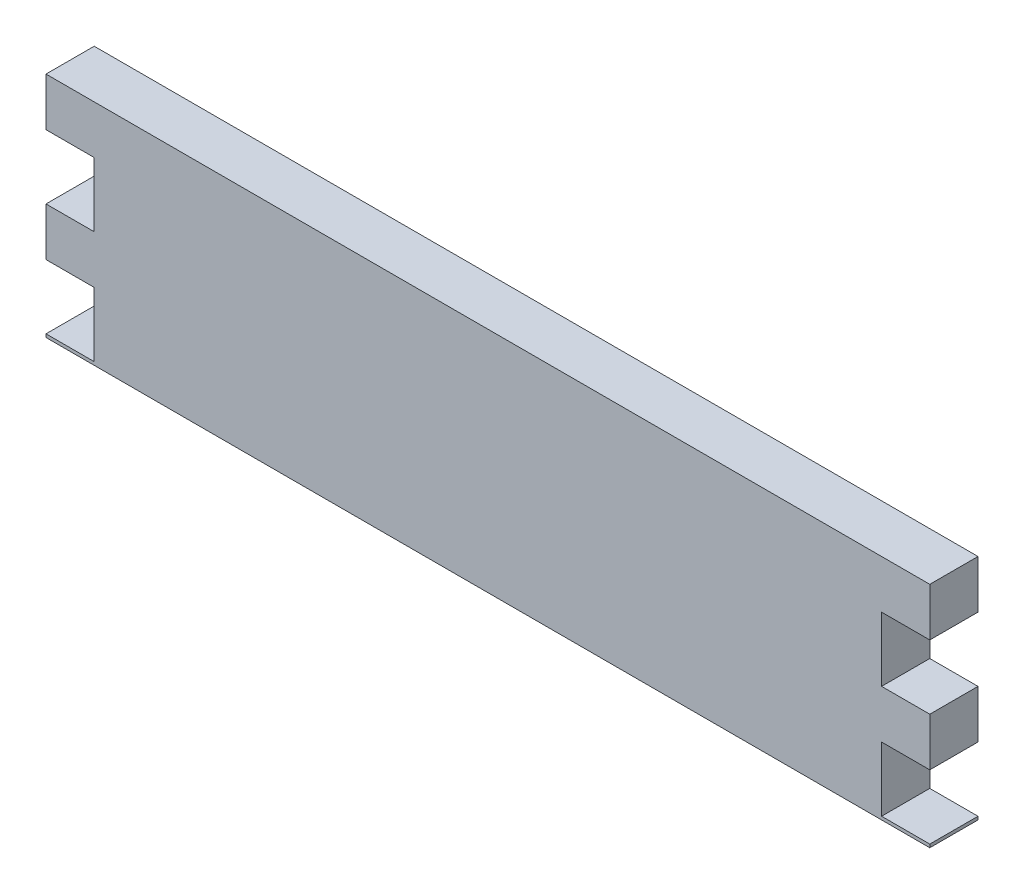
ISO-10303-21;
HEADER;
FILE_DESCRIPTION(('STEP AP214'),'2;1');
FILE_NAME('part.step','',(''),(''),'','','');
FILE_SCHEMA(('AUTOMOTIVE_DESIGN { 1 0 10303 214 1 1 1 1 }'));
ENDSEC;
DATA;
#1=APPLICATION_CONTEXT('core data for automotive mechanical design processes');
#2=APPLICATION_PROTOCOL_DEFINITION('international standard','automotive_design',2000,#1);
#3=PRODUCT_CONTEXT('',#1,'mechanical');
#4=PRODUCT('Part','Part','',(#3));
#5=PRODUCT_RELATED_PRODUCT_CATEGORY('part','',(#4));
#6=PRODUCT_DEFINITION_FORMATION('','',#4);
#7=PRODUCT_DEFINITION_CONTEXT('part definition',#1,'design');
#8=PRODUCT_DEFINITION('design','',#6,#7);
#9=PRODUCT_DEFINITION_SHAPE('','',#8);
#10=(LENGTH_UNIT() NAMED_UNIT(*) SI_UNIT(.MILLI.,.METRE.));
#11=(NAMED_UNIT(*) PLANE_ANGLE_UNIT() SI_UNIT($,.RADIAN.));
#12=(NAMED_UNIT(*) SI_UNIT($,.STERADIAN.) SOLID_ANGLE_UNIT());
#13=UNCERTAINTY_MEASURE_WITH_UNIT(LENGTH_MEASURE(1.E-05),#10,'distance_accuracy_value','');
#14=(GEOMETRIC_REPRESENTATION_CONTEXT(3) GLOBAL_UNCERTAINTY_ASSIGNED_CONTEXT((#13)) GLOBAL_UNIT_ASSIGNED_CONTEXT((#10,
#11,#12)) REPRESENTATION_CONTEXT('',''));
#15=CARTESIAN_POINT('',(0.,0.,0.));
#16=DIRECTION('',(0.,0.,1.));
#17=DIRECTION('',(1.,0.,0.));
#18=AXIS2_PLACEMENT_3D('',#15,#16,#17);
#19=CARTESIAN_POINT('',(27.5,-7.1,3.));
#20=DIRECTION('',(-1.,0.,0.));
#21=DIRECTION('',(0.,0.,1.));
#22=AXIS2_PLACEMENT_3D('',#19,#20,#21);
#23=PLANE('',#22);
#24=DIRECTION('',(0.,1.,0.));
#25=VECTOR('',#24,1.);
#26=CARTESIAN_POINT('',(27.5,-7.1,0.));
#27=LINE('',#26,#25);
#28=CARTESIAN_POINT('',(27.5,-2.9,0.));
#29=VERTEX_POINT('',#28);
#30=CARTESIAN_POINT('',(27.5,0.0999999999999998,0.));
#31=VERTEX_POINT('',#30);
#32=EDGE_CURVE('E223',#29,#31,#27,.T.);
#33=ORIENTED_EDGE('',*,*,#32,.T.);
#34=DIRECTION('',(0.,0.,1.));
#35=VECTOR('',#34,1.);
#36=CARTESIAN_POINT('',(27.5,0.0999999999999998,-7.));
#37=LINE('',#36,#35);
#38=CARTESIAN_POINT('',(27.5,0.0999999999999998,3.));
#39=VERTEX_POINT('',#38);
#40=EDGE_CURVE('E295',#31,#39,#37,.T.);
#41=ORIENTED_EDGE('',*,*,#40,.T.);
#42=DIRECTION('',(0.,1.,0.));
#43=VECTOR('',#42,1.);
#44=CARTESIAN_POINT('',(27.5,-7.1,3.));
#45=LINE('',#44,#43);
#46=CARTESIAN_POINT('',(27.5,-2.9,3.));
#47=VERTEX_POINT('',#46);
#48=EDGE_CURVE('E197',#47,#39,#45,.T.);
#49=ORIENTED_EDGE('',*,*,#48,.F.);
#50=DIRECTION('',(0.,0.,1.));
#51=VECTOR('',#50,1.);
#52=CARTESIAN_POINT('',(27.5,-2.9,-7.));
#53=LINE('',#52,#51);
#54=EDGE_CURVE('E319',#29,#47,#53,.T.);
#55=ORIENTED_EDGE('',*,*,#54,.F.);
#56=EDGE_LOOP('',(#33,#41,#49,#55));
#57=FACE_BOUND('',#56,.T.);
#58=ADVANCED_FACE('F38',(#57),#23,.F.);
#59=CARTESIAN_POINT('',(27.5,-7.1,0.));
#60=VERTEX_POINT('',#59);
#61=CARTESIAN_POINT('',(27.5,-6.9,0.));
#62=VERTEX_POINT('',#61);
#63=EDGE_CURVE('E219',#60,#62,#27,.T.);
#64=ORIENTED_EDGE('',*,*,#63,.T.);
#65=DIRECTION('',(0.,0.,1.));
#66=VECTOR('',#65,1.);
#67=CARTESIAN_POINT('',(27.5,-6.9,-7.));
#68=LINE('',#67,#66);
#69=CARTESIAN_POINT('',(27.5,-6.9,3.));
#70=VERTEX_POINT('',#69);
#71=EDGE_CURVE('E320',#62,#70,#68,.T.);
#72=ORIENTED_EDGE('',*,*,#71,.T.);
#73=CARTESIAN_POINT('',(27.5,-7.1,3.));
#74=VERTEX_POINT('',#73);
#75=EDGE_CURVE('E200',#74,#70,#45,.T.);
#76=ORIENTED_EDGE('',*,*,#75,.F.);
#77=DIRECTION('',(0.,0.,-1.));
#78=VECTOR('',#77,1.);
#79=CARTESIAN_POINT('',(27.5,-7.1,3.));
#80=LINE('',#79,#78);
#81=EDGE_CURVE('E218',#74,#60,#80,.T.);
#82=ORIENTED_EDGE('',*,*,#81,.T.);
#83=EDGE_LOOP('',(#64,#72,#76,#82));
#84=FACE_BOUND('',#83,.T.);
#85=ADVANCED_FACE('F352',(#84),#23,.F.);
#86=CARTESIAN_POINT('',(-27.5,-7.1,3.));
#87=DIRECTION('',(1.,0.,0.));
#88=DIRECTION('',(0.,0.,-1.));
#89=AXIS2_PLACEMENT_3D('',#86,#87,#88);
#90=PLANE('',#89);
#91=DIRECTION('',(0.,-1.,0.));
#92=VECTOR('',#91,1.);
#93=CARTESIAN_POINT('',(-27.5,-7.1,0.));
#94=LINE('',#93,#92);
#95=CARTESIAN_POINT('',(-27.5,7.1,0.));
#96=VERTEX_POINT('',#95);
#97=CARTESIAN_POINT('',(-27.5,4.1,0.));
#98=VERTEX_POINT('',#97);
#99=EDGE_CURVE('E201',#96,#98,#94,.T.);
#100=ORIENTED_EDGE('',*,*,#99,.T.);
#101=DIRECTION('',(0.,0.,1.));
#102=VECTOR('',#101,1.);
#103=CARTESIAN_POINT('',(-27.5,4.1,-7.));
#104=LINE('',#103,#102);
#105=CARTESIAN_POINT('',(-27.5,4.1,3.));
#106=VERTEX_POINT('',#105);
#107=EDGE_CURVE('E269',#98,#106,#104,.T.);
#108=ORIENTED_EDGE('',*,*,#107,.T.);
#109=DIRECTION('',(0.,-1.,0.));
#110=VECTOR('',#109,1.);
#111=CARTESIAN_POINT('',(-27.5,-7.1,3.));
#112=LINE('',#111,#110);
#113=CARTESIAN_POINT('',(-27.5,7.1,3.));
#114=VERTEX_POINT('',#113);
#115=EDGE_CURVE('E214',#114,#106,#112,.T.);
#116=ORIENTED_EDGE('',*,*,#115,.F.);
#117=DIRECTION('',(0.,0.,-1.));
#118=VECTOR('',#117,1.);
#119=CARTESIAN_POINT('',(-27.5,7.1,3.));
#120=LINE('',#119,#118);
#121=EDGE_CURVE('E235',#114,#96,#120,.T.);
#122=ORIENTED_EDGE('',*,*,#121,.T.);
#123=EDGE_LOOP('',(#100,#108,#116,#122));
#124=FACE_BOUND('',#123,.T.);
#125=ADVANCED_FACE('F398',(#124),#90,.F.);
#126=CARTESIAN_POINT('',(-27.5,0.0999999999999994,3.));
#127=VERTEX_POINT('',#126);
#128=CARTESIAN_POINT('',(-27.5,-2.9,3.));
#129=VERTEX_POINT('',#128);
#130=EDGE_CURVE('E212',#127,#129,#112,.T.);
#131=ORIENTED_EDGE('',*,*,#130,.F.);
#132=DIRECTION('',(0.,0.,1.));
#133=VECTOR('',#132,1.);
#134=CARTESIAN_POINT('',(-27.5,0.0999999999999994,-7.));
#135=LINE('',#134,#133);
#136=CARTESIAN_POINT('',(-27.5,0.0999999999999994,0.));
#137=VERTEX_POINT('',#136);
#138=EDGE_CURVE('E283',#137,#127,#135,.T.);
#139=ORIENTED_EDGE('',*,*,#138,.F.);
#140=CARTESIAN_POINT('',(-27.5,-2.9,0.));
#141=VERTEX_POINT('',#140);
#142=EDGE_CURVE('E228',#137,#141,#94,.T.);
#143=ORIENTED_EDGE('',*,*,#142,.T.);
#144=DIRECTION('',(0.,0.,1.));
#145=VECTOR('',#144,1.);
#146=CARTESIAN_POINT('',(-27.5,-2.9,-7.));
#147=LINE('',#146,#145);
#148=EDGE_CURVE('E292',#141,#129,#147,.T.);
#149=ORIENTED_EDGE('',*,*,#148,.T.);
#150=EDGE_LOOP('',(#131,#139,#143,#149));
#151=FACE_BOUND('',#150,.T.);
#152=ADVANCED_FACE('F368',(#151),#90,.F.);
#153=CARTESIAN_POINT('',(27.5,4.1,3.));
#154=VERTEX_POINT('',#153);
#155=CARTESIAN_POINT('',(27.5,7.1,3.));
#156=VERTEX_POINT('',#155);
#157=EDGE_CURVE('E187',#154,#156,#45,.T.);
#158=ORIENTED_EDGE('',*,*,#157,.F.);
#159=DIRECTION('',(0.,0.,1.));
#160=VECTOR('',#159,1.);
#161=CARTESIAN_POINT('',(27.5,4.1,-7.));
#162=LINE('',#161,#160);
#163=CARTESIAN_POINT('',(27.5,4.1,0.));
#164=VERTEX_POINT('',#163);
#165=EDGE_CURVE('E172',#164,#154,#162,.T.);
#166=ORIENTED_EDGE('',*,*,#165,.F.);
#167=CARTESIAN_POINT('',(27.5,7.1,0.));
#168=VERTEX_POINT('',#167);
#169=EDGE_CURVE('E224',#164,#168,#27,.T.);
#170=ORIENTED_EDGE('',*,*,#169,.T.);
#171=DIRECTION('',(0.,0.,-1.));
#172=VECTOR('',#171,1.);
#173=CARTESIAN_POINT('',(27.5,7.1,3.));
#174=LINE('',#173,#172);
#175=EDGE_CURVE('E196',#156,#168,#174,.T.);
#176=ORIENTED_EDGE('',*,*,#175,.F.);
#177=EDGE_LOOP('',(#158,#166,#170,#176));
#178=FACE_BOUND('',#177,.T.);
#179=ADVANCED_FACE('F40',(#178),#23,.F.);
#180=CARTESIAN_POINT('',(-27.5,7.1,3.));
#181=DIRECTION('',(0.,-1.,0.));
#182=DIRECTION('',(0.,0.,-1.));
#183=AXIS2_PLACEMENT_3D('',#180,#181,#182);
#184=PLANE('',#183);
#185=DIRECTION('',(-1.,0.,0.));
#186=VECTOR('',#185,1.);
#187=CARTESIAN_POINT('',(-27.5,7.1,0.));
#188=LINE('',#187,#186);
#189=EDGE_CURVE('E222',#168,#96,#188,.T.);
#190=ORIENTED_EDGE('',*,*,#189,.T.);
#191=ORIENTED_EDGE('',*,*,#121,.F.);
#192=DIRECTION('',(-1.,0.,0.));
#193=VECTOR('',#192,1.);
#194=CARTESIAN_POINT('',(-27.5,7.1,3.));
#195=LINE('',#194,#193);
#196=EDGE_CURVE('E206',#156,#114,#195,.T.);
#197=ORIENTED_EDGE('',*,*,#196,.F.);
#198=ORIENTED_EDGE('',*,*,#175,.T.);
#199=EDGE_LOOP('',(#190,#191,#197,#198));
#200=FACE_BOUND('',#199,.T.);
#201=ADVANCED_FACE('F400',(#200),#184,.F.);
#202=CARTESIAN_POINT('',(-27.5,-6.9,3.));
#203=VERTEX_POINT('',#202);
#204=CARTESIAN_POINT('',(-27.5,-7.1,3.));
#205=VERTEX_POINT('',#204);
#206=EDGE_CURVE('E209',#203,#205,#112,.T.);
#207=ORIENTED_EDGE('',*,*,#206,.F.);
#208=DIRECTION('',(0.,0.,1.));
#209=VECTOR('',#208,1.);
#210=CARTESIAN_POINT('',(-27.5,-6.9,-7.));
#211=LINE('',#210,#209);
#212=CARTESIAN_POINT('',(-27.5,-6.9,0.));
#213=VERTEX_POINT('',#212);
#214=EDGE_CURVE('E285',#213,#203,#211,.T.);
#215=ORIENTED_EDGE('',*,*,#214,.F.);
#216=CARTESIAN_POINT('',(-27.5,-7.1,0.));
#217=VERTEX_POINT('',#216);
#218=EDGE_CURVE('E226',#213,#217,#94,.T.);
#219=ORIENTED_EDGE('',*,*,#218,.T.);
#220=DIRECTION('',(0.,0.,-1.));
#221=VECTOR('',#220,1.);
#222=CARTESIAN_POINT('',(-27.5,-7.1,3.));
#223=LINE('',#222,#221);
#224=EDGE_CURVE('E232',#205,#217,#223,.T.);
#225=ORIENTED_EDGE('',*,*,#224,.F.);
#226=EDGE_LOOP('',(#207,#215,#219,#225));
#227=FACE_BOUND('',#226,.T.);
#228=ADVANCED_FACE('F405',(#227),#90,.F.);
#229=CARTESIAN_POINT('',(-27.5,-7.1,3.));
#230=DIRECTION('',(0.,1.,0.));
#231=DIRECTION('',(0.,0.,1.));
#232=AXIS2_PLACEMENT_3D('',#229,#230,#231);
#233=PLANE('',#232);
#234=DIRECTION('',(1.,0.,0.));
#235=VECTOR('',#234,1.);
#236=CARTESIAN_POINT('',(-27.5,-7.1,0.));
#237=LINE('',#236,#235);
#238=EDGE_CURVE('E198',#217,#60,#237,.T.);
#239=ORIENTED_EDGE('',*,*,#238,.T.);
#240=ORIENTED_EDGE('',*,*,#81,.F.);
#241=DIRECTION('',(1.,0.,0.));
#242=VECTOR('',#241,1.);
#243=CARTESIAN_POINT('',(-27.5,-7.1,3.));
#244=LINE('',#243,#242);
#245=EDGE_CURVE('E216',#205,#74,#244,.T.);
#246=ORIENTED_EDGE('',*,*,#245,.F.);
#247=ORIENTED_EDGE('',*,*,#224,.T.);
#248=EDGE_LOOP('',(#239,#240,#246,#247));
#249=FACE_BOUND('',#248,.T.);
#250=ADVANCED_FACE('F356',(#249),#233,.F.);
#251=CARTESIAN_POINT('',(0.,0.,3.));
#252=DIRECTION('',(0.,0.,-1.));
#253=DIRECTION('',(-1.,0.,0.));
#254=AXIS2_PLACEMENT_3D('',#251,#252,#253);
#255=PLANE('',#254);
#256=ORIENTED_EDGE('',*,*,#48,.T.);
#257=DIRECTION('',(1.,0.,0.));
#258=VECTOR('',#257,1.);
#259=CARTESIAN_POINT('',(27.5,0.0999999999999998,3.));
#260=LINE('',#259,#258);
#261=CARTESIAN_POINT('',(24.5,0.0999999999999994,3.));
#262=VERTEX_POINT('',#261);
#263=EDGE_CURVE('E182',#262,#39,#260,.T.);
#264=ORIENTED_EDGE('',*,*,#263,.F.);
#265=DIRECTION('',(0.,-1.,0.));
#266=VECTOR('',#265,1.);
#267=CARTESIAN_POINT('',(24.5,4.1,3.));
#268=LINE('',#267,#266);
#269=CARTESIAN_POINT('',(24.5,4.1,3.));
#270=VERTEX_POINT('',#269);
#271=EDGE_CURVE('E191',#270,#262,#268,.T.);
#272=ORIENTED_EDGE('',*,*,#271,.F.);
#273=DIRECTION('',(-1.,0.,0.));
#274=VECTOR('',#273,1.);
#275=CARTESIAN_POINT('',(27.5,4.1,3.));
#276=LINE('',#275,#274);
#277=EDGE_CURVE('E175',#154,#270,#276,.T.);
#278=ORIENTED_EDGE('',*,*,#277,.F.);
#279=ORIENTED_EDGE('',*,*,#157,.T.);
#280=ORIENTED_EDGE('',*,*,#196,.T.);
#281=ORIENTED_EDGE('',*,*,#115,.T.);
#282=DIRECTION('',(-1.,0.,0.));
#283=VECTOR('',#282,1.);
#284=CARTESIAN_POINT('',(-27.5,4.1,3.));
#285=LINE('',#284,#283);
#286=CARTESIAN_POINT('',(-24.5,4.1,3.));
#287=VERTEX_POINT('',#286);
#288=EDGE_CURVE('E279',#287,#106,#285,.T.);
#289=ORIENTED_EDGE('',*,*,#288,.F.);
#290=DIRECTION('',(0.,1.,0.));
#291=VECTOR('',#290,1.);
#292=CARTESIAN_POINT('',(-24.5,4.1,3.));
#293=LINE('',#292,#291);
#294=CARTESIAN_POINT('',(-24.5,0.0999999999999994,3.));
#295=VERTEX_POINT('',#294);
#296=EDGE_CURVE('E306',#295,#287,#293,.T.);
#297=ORIENTED_EDGE('',*,*,#296,.F.);
#298=DIRECTION('',(1.,0.,0.));
#299=VECTOR('',#298,1.);
#300=CARTESIAN_POINT('',(-27.5,0.0999999999999994,3.));
#301=LINE('',#300,#299);
#302=EDGE_CURVE('E301',#127,#295,#301,.T.);
#303=ORIENTED_EDGE('',*,*,#302,.F.);
#304=ORIENTED_EDGE('',*,*,#130,.T.);
#305=DIRECTION('',(-1.,0.,0.));
#306=VECTOR('',#305,1.);
#307=CARTESIAN_POINT('',(-27.5,-2.9,3.));
#308=LINE('',#307,#306);
#309=CARTESIAN_POINT('',(-24.5,-2.9,3.));
#310=VERTEX_POINT('',#309);
#311=EDGE_CURVE('E287',#310,#129,#308,.T.);
#312=ORIENTED_EDGE('',*,*,#311,.F.);
#313=DIRECTION('',(0.,1.,0.));
#314=VECTOR('',#313,1.);
#315=CARTESIAN_POINT('',(-24.5,-2.9,3.));
#316=LINE('',#315,#314);
#317=CARTESIAN_POINT('',(-24.5,-6.9,3.));
#318=VERTEX_POINT('',#317);
#319=EDGE_CURVE('E297',#318,#310,#316,.T.);
#320=ORIENTED_EDGE('',*,*,#319,.F.);
#321=DIRECTION('',(1.,0.,0.));
#322=VECTOR('',#321,1.);
#323=CARTESIAN_POINT('',(-27.5,-6.9,3.));
#324=LINE('',#323,#322);
#325=EDGE_CURVE('E299',#203,#318,#324,.T.);
#326=ORIENTED_EDGE('',*,*,#325,.F.);
#327=ORIENTED_EDGE('',*,*,#206,.T.);
#328=ORIENTED_EDGE('',*,*,#245,.T.);
#329=ORIENTED_EDGE('',*,*,#75,.T.);
#330=DIRECTION('',(1.,0.,0.));
#331=VECTOR('',#330,1.);
#332=CARTESIAN_POINT('',(27.5,-6.9,3.));
#333=LINE('',#332,#331);
#334=CARTESIAN_POINT('',(24.5,-6.9,3.));
#335=VERTEX_POINT('',#334);
#336=EDGE_CURVE('E317',#335,#70,#333,.T.);
#337=ORIENTED_EDGE('',*,*,#336,.F.);
#338=DIRECTION('',(0.,-1.,0.));
#339=VECTOR('',#338,1.);
#340=CARTESIAN_POINT('',(24.5,-2.9,3.));
#341=LINE('',#340,#339);
#342=CARTESIAN_POINT('',(24.5,-2.9,3.));
#343=VERTEX_POINT('',#342);
#344=EDGE_CURVE('E314',#343,#335,#341,.T.);
#345=ORIENTED_EDGE('',*,*,#344,.F.);
#346=DIRECTION('',(-1.,0.,0.));
#347=VECTOR('',#346,1.);
#348=CARTESIAN_POINT('',(27.5,-2.9,3.));
#349=LINE('',#348,#347);
#350=EDGE_CURVE('E192',#47,#343,#349,.T.);
#351=ORIENTED_EDGE('',*,*,#350,.F.);
#352=EDGE_LOOP('',(#256,#264,#272,#278,#279,#280,#281,#289,#297,#303,#304,#312,#320,#326,#327,
#328,#329,#337,#345,#351));
#353=FACE_BOUND('',#352,.T.);
#354=ADVANCED_FACE('F186',(#353),#255,.F.);
#355=CARTESIAN_POINT('',(0.,0.,0.));
#356=DIRECTION('',(0.,0.,-1.));
#357=DIRECTION('',(-1.,0.,0.));
#358=AXIS2_PLACEMENT_3D('',#355,#356,#357);
#359=PLANE('',#358);
#360=DIRECTION('',(-1.,0.,0.));
#361=VECTOR('',#360,1.);
#362=CARTESIAN_POINT('',(0.,0.0999999999999959,0.));
#363=LINE('',#362,#361);
#364=CARTESIAN_POINT('',(24.5,0.0999999999999994,0.));
#365=VERTEX_POINT('',#364);
#366=EDGE_CURVE('E11',#31,#365,#363,.T.);
#367=ORIENTED_EDGE('',*,*,#366,.F.);
#368=ORIENTED_EDGE('',*,*,#32,.F.);
#369=DIRECTION('',(1.,0.,0.));
#370=VECTOR('',#369,1.);
#371=CARTESIAN_POINT('',(0.,-2.9,0.));
#372=LINE('',#371,#370);
#373=CARTESIAN_POINT('',(24.5,-2.9,0.));
#374=VERTEX_POINT('',#373);
#375=EDGE_CURVE('E253',#374,#29,#372,.T.);
#376=ORIENTED_EDGE('',*,*,#375,.F.);
#377=DIRECTION('',(0.,1.,0.));
#378=VECTOR('',#377,1.);
#379=CARTESIAN_POINT('',(24.5,0.,0.));
#380=LINE('',#379,#378);
#381=CARTESIAN_POINT('',(24.5,-6.9,0.));
#382=VERTEX_POINT('',#381);
#383=EDGE_CURVE('E255',#382,#374,#380,.T.);
#384=ORIENTED_EDGE('',*,*,#383,.F.);
#385=DIRECTION('',(-1.,0.,0.));
#386=VECTOR('',#385,1.);
#387=CARTESIAN_POINT('',(0.,-6.9,0.));
#388=LINE('',#387,#386);
#389=EDGE_CURVE('E257',#62,#382,#388,.T.);
#390=ORIENTED_EDGE('',*,*,#389,.F.);
#391=ORIENTED_EDGE('',*,*,#63,.F.);
#392=ORIENTED_EDGE('',*,*,#238,.F.);
#393=ORIENTED_EDGE('',*,*,#218,.F.);
#394=DIRECTION('',(-1.,0.,0.));
#395=VECTOR('',#394,1.);
#396=CARTESIAN_POINT('',(0.,-6.9,0.));
#397=LINE('',#396,#395);
#398=CARTESIAN_POINT('',(-24.5,-6.9,0.));
#399=VERTEX_POINT('',#398);
#400=EDGE_CURVE('E239',#399,#213,#397,.T.);
#401=ORIENTED_EDGE('',*,*,#400,.F.);
#402=DIRECTION('',(0.,-1.,0.));
#403=VECTOR('',#402,1.);
#404=CARTESIAN_POINT('',(-24.5,0.,0.));
#405=LINE('',#404,#403);
#406=CARTESIAN_POINT('',(-24.5,-2.9,0.));
#407=VERTEX_POINT('',#406);
#408=EDGE_CURVE('E241',#407,#399,#405,.T.);
#409=ORIENTED_EDGE('',*,*,#408,.F.);
#410=DIRECTION('',(1.,0.,0.));
#411=VECTOR('',#410,1.);
#412=CARTESIAN_POINT('',(0.,-2.9,0.));
#413=LINE('',#412,#411);
#414=EDGE_CURVE('E244',#141,#407,#413,.T.);
#415=ORIENTED_EDGE('',*,*,#414,.F.);
#416=ORIENTED_EDGE('',*,*,#142,.F.);
#417=DIRECTION('',(-1.,0.,0.));
#418=VECTOR('',#417,1.);
#419=CARTESIAN_POINT('',(0.,0.0999999999999994,0.));
#420=LINE('',#419,#418);
#421=CARTESIAN_POINT('',(-24.5,0.0999999999999994,0.));
#422=VERTEX_POINT('',#421);
#423=EDGE_CURVE('E246',#422,#137,#420,.T.);
#424=ORIENTED_EDGE('',*,*,#423,.F.);
#425=DIRECTION('',(0.,-1.,0.));
#426=VECTOR('',#425,1.);
#427=CARTESIAN_POINT('',(-24.5,0.,0.));
#428=LINE('',#427,#426);
#429=CARTESIAN_POINT('',(-24.5,4.1,0.));
#430=VERTEX_POINT('',#429);
#431=EDGE_CURVE('E248',#430,#422,#428,.T.);
#432=ORIENTED_EDGE('',*,*,#431,.F.);
#433=DIRECTION('',(1.,0.,0.));
#434=VECTOR('',#433,1.);
#435=CARTESIAN_POINT('',(0.,4.1,0.));
#436=LINE('',#435,#434);
#437=EDGE_CURVE('E251',#98,#430,#436,.T.);
#438=ORIENTED_EDGE('',*,*,#437,.F.);
#439=ORIENTED_EDGE('',*,*,#99,.F.);
#440=ORIENTED_EDGE('',*,*,#189,.F.);
#441=ORIENTED_EDGE('',*,*,#169,.F.);
#442=DIRECTION('',(1.,0.,0.));
#443=VECTOR('',#442,1.);
#444=CARTESIAN_POINT('',(0.,4.10000000000001,0.));
#445=LINE('',#444,#443);
#446=CARTESIAN_POINT('',(24.5,4.1,0.));
#447=VERTEX_POINT('',#446);
#448=EDGE_CURVE('E178',#447,#164,#445,.T.);
#449=ORIENTED_EDGE('',*,*,#448,.F.);
#450=DIRECTION('',(0.,1.,0.));
#451=VECTOR('',#450,1.);
#452=CARTESIAN_POINT('',(24.5,0.,0.));
#453=LINE('',#452,#451);
#454=EDGE_CURVE('E46',#365,#447,#453,.T.);
#455=ORIENTED_EDGE('',*,*,#454,.F.);
#456=EDGE_LOOP('',(#367,#368,#376,#384,#390,#391,#392,#393,#401,#409,#415,#416,#424,#432,#438,
#439,#440,#441,#449,#455));
#457=FACE_BOUND('',#456,.T.);
#458=ADVANCED_FACE('F266',(#457),#359,.T.);
#459=CARTESIAN_POINT('',(-27.5,-2.9,-7.));
#460=DIRECTION('',(0.,1.,0.));
#461=DIRECTION('',(0.,0.,1.));
#462=AXIS2_PLACEMENT_3D('',#459,#460,#461);
#463=PLANE('',#462);
#464=ORIENTED_EDGE('',*,*,#414,.T.);
#465=DIRECTION('',(0.,0.,1.));
#466=VECTOR('',#465,1.);
#467=CARTESIAN_POINT('',(-24.5,-2.9,-7.));
#468=LINE('',#467,#466);
#469=EDGE_CURVE('E290',#407,#310,#468,.T.);
#470=ORIENTED_EDGE('',*,*,#469,.T.);
#471=ORIENTED_EDGE('',*,*,#311,.T.);
#472=ORIENTED_EDGE('',*,*,#148,.F.);
#473=EDGE_LOOP('',(#464,#470,#471,#472));
#474=FACE_BOUND('',#473,.T.);
#475=ADVANCED_FACE('F375',(#474),#463,.F.);
#476=CARTESIAN_POINT('',(-24.5,-2.9,-7.));
#477=DIRECTION('',(1.,0.,0.));
#478=DIRECTION('',(0.,0.,-1.));
#479=AXIS2_PLACEMENT_3D('',#476,#477,#478);
#480=PLANE('',#479);
#481=ORIENTED_EDGE('',*,*,#408,.T.);
#482=DIRECTION('',(0.,0.,1.));
#483=VECTOR('',#482,1.);
#484=CARTESIAN_POINT('',(-24.5,-6.9,-7.));
#485=LINE('',#484,#483);
#486=EDGE_CURVE('E288',#399,#318,#485,.T.);
#487=ORIENTED_EDGE('',*,*,#486,.T.);
#488=ORIENTED_EDGE('',*,*,#319,.T.);
#489=ORIENTED_EDGE('',*,*,#469,.F.);
#490=EDGE_LOOP('',(#481,#487,#488,#489));
#491=FACE_BOUND('',#490,.T.);
#492=ADVANCED_FACE('F377',(#491),#480,.F.);
#493=CARTESIAN_POINT('',(-27.5,-6.9,-7.));
#494=DIRECTION('',(0.,-1.,0.));
#495=DIRECTION('',(0.,0.,-1.));
#496=AXIS2_PLACEMENT_3D('',#493,#494,#495);
#497=PLANE('',#496);
#498=ORIENTED_EDGE('',*,*,#400,.T.);
#499=ORIENTED_EDGE('',*,*,#214,.T.);
#500=ORIENTED_EDGE('',*,*,#325,.T.);
#501=ORIENTED_EDGE('',*,*,#486,.F.);
#502=EDGE_LOOP('',(#498,#499,#500,#501));
#503=FACE_BOUND('',#502,.T.);
#504=ADVANCED_FACE('F419',(#503),#497,.F.);
#505=CARTESIAN_POINT('',(-27.5,4.1,-7.));
#506=DIRECTION('',(0.,1.,0.));
#507=DIRECTION('',(0.,0.,1.));
#508=AXIS2_PLACEMENT_3D('',#505,#506,#507);
#509=PLANE('',#508);
#510=ORIENTED_EDGE('',*,*,#437,.T.);
#511=DIRECTION('',(0.,0.,1.));
#512=VECTOR('',#511,1.);
#513=CARTESIAN_POINT('',(-24.5,4.1,-7.));
#514=LINE('',#513,#512);
#515=EDGE_CURVE('E272',#430,#287,#514,.T.);
#516=ORIENTED_EDGE('',*,*,#515,.T.);
#517=ORIENTED_EDGE('',*,*,#288,.T.);
#518=ORIENTED_EDGE('',*,*,#107,.F.);
#519=EDGE_LOOP('',(#510,#516,#517,#518));
#520=FACE_BOUND('',#519,.T.);
#521=ADVANCED_FACE('F392',(#520),#509,.F.);
#522=CARTESIAN_POINT('',(-24.5,4.1,-7.));
#523=DIRECTION('',(1.,0.,0.));
#524=DIRECTION('',(0.,0.,-1.));
#525=AXIS2_PLACEMENT_3D('',#522,#523,#524);
#526=PLANE('',#525);
#527=ORIENTED_EDGE('',*,*,#431,.T.);
#528=DIRECTION('',(0.,0.,1.));
#529=VECTOR('',#528,1.);
#530=CARTESIAN_POINT('',(-24.5,0.0999999999999994,-7.));
#531=LINE('',#530,#529);
#532=EDGE_CURVE('E276',#422,#295,#531,.T.);
#533=ORIENTED_EDGE('',*,*,#532,.T.);
#534=ORIENTED_EDGE('',*,*,#296,.T.);
#535=ORIENTED_EDGE('',*,*,#515,.F.);
#536=EDGE_LOOP('',(#527,#533,#534,#535));
#537=FACE_BOUND('',#536,.T.);
#538=ADVANCED_FACE('F382',(#537),#526,.F.);
#539=CARTESIAN_POINT('',(-27.5,0.0999999999999994,-7.));
#540=DIRECTION('',(0.,-1.,0.));
#541=DIRECTION('',(0.,0.,-1.));
#542=AXIS2_PLACEMENT_3D('',#539,#540,#541);
#543=PLANE('',#542);
#544=ORIENTED_EDGE('',*,*,#423,.T.);
#545=ORIENTED_EDGE('',*,*,#138,.T.);
#546=ORIENTED_EDGE('',*,*,#302,.T.);
#547=ORIENTED_EDGE('',*,*,#532,.F.);
#548=EDGE_LOOP('',(#544,#545,#546,#547));
#549=FACE_BOUND('',#548,.T.);
#550=ADVANCED_FACE('F383',(#549),#543,.F.);
#551=CARTESIAN_POINT('',(27.5,-6.9,-7.));
#552=DIRECTION('',(0.,-1.,0.));
#553=DIRECTION('',(0.,0.,-1.));
#554=AXIS2_PLACEMENT_3D('',#551,#552,#553);
#555=PLANE('',#554);
#556=ORIENTED_EDGE('',*,*,#389,.T.);
#557=DIRECTION('',(0.,0.,1.));
#558=VECTOR('',#557,1.);
#559=CARTESIAN_POINT('',(24.5,-6.9,-7.));
#560=LINE('',#559,#558);
#561=EDGE_CURVE('E323',#382,#335,#560,.T.);
#562=ORIENTED_EDGE('',*,*,#561,.T.);
#563=ORIENTED_EDGE('',*,*,#336,.T.);
#564=ORIENTED_EDGE('',*,*,#71,.F.);
#565=EDGE_LOOP('',(#556,#562,#563,#564));
#566=FACE_BOUND('',#565,.T.);
#567=ADVANCED_FACE('F348',(#566),#555,.F.);
#568=CARTESIAN_POINT('',(24.5,-2.9,-7.));
#569=DIRECTION('',(-1.,0.,0.));
#570=DIRECTION('',(0.,0.,1.));
#571=AXIS2_PLACEMENT_3D('',#568,#569,#570);
#572=PLANE('',#571);
#573=ORIENTED_EDGE('',*,*,#383,.T.);
#574=DIRECTION('',(0.,0.,1.));
#575=VECTOR('',#574,1.);
#576=CARTESIAN_POINT('',(24.5,-2.9,-7.));
#577=LINE('',#576,#575);
#578=EDGE_CURVE('E61',#374,#343,#577,.T.);
#579=ORIENTED_EDGE('',*,*,#578,.T.);
#580=ORIENTED_EDGE('',*,*,#344,.T.);
#581=ORIENTED_EDGE('',*,*,#561,.F.);
#582=EDGE_LOOP('',(#573,#579,#580,#581));
#583=FACE_BOUND('',#582,.T.);
#584=ADVANCED_FACE('F346',(#583),#572,.F.);
#585=CARTESIAN_POINT('',(27.5,-2.9,-7.));
#586=DIRECTION('',(0.,1.,0.));
#587=DIRECTION('',(0.,0.,1.));
#588=AXIS2_PLACEMENT_3D('',#585,#586,#587);
#589=PLANE('',#588);
#590=ORIENTED_EDGE('',*,*,#375,.T.);
#591=ORIENTED_EDGE('',*,*,#54,.T.);
#592=ORIENTED_EDGE('',*,*,#350,.T.);
#593=ORIENTED_EDGE('',*,*,#578,.F.);
#594=EDGE_LOOP('',(#590,#591,#592,#593));
#595=FACE_BOUND('',#594,.T.);
#596=ADVANCED_FACE('F342',(#595),#589,.F.);
#597=CARTESIAN_POINT('',(27.5,0.0999999999999998,-7.));
#598=DIRECTION('',(0.,-1.,0.));
#599=DIRECTION('',(1.,0.,0.));
#600=AXIS2_PLACEMENT_3D('',#597,#598,#599);
#601=PLANE('',#600);
#602=ORIENTED_EDGE('',*,*,#366,.T.);
#603=DIRECTION('',(0.,0.,1.));
#604=VECTOR('',#603,1.);
#605=CARTESIAN_POINT('',(24.5,0.0999999999999994,-7.));
#606=LINE('',#605,#604);
#607=EDGE_CURVE('E263',#365,#262,#606,.T.);
#608=ORIENTED_EDGE('',*,*,#607,.T.);
#609=ORIENTED_EDGE('',*,*,#263,.T.);
#610=ORIENTED_EDGE('',*,*,#40,.F.);
#611=EDGE_LOOP('',(#602,#608,#609,#610));
#612=FACE_BOUND('',#611,.T.);
#613=ADVANCED_FACE('F335',(#612),#601,.F.);
#614=CARTESIAN_POINT('',(24.5,4.1,-7.));
#615=DIRECTION('',(-1.,0.,0.));
#616=DIRECTION('',(0.,0.,1.));
#617=AXIS2_PLACEMENT_3D('',#614,#615,#616);
#618=PLANE('',#617);
#619=ORIENTED_EDGE('',*,*,#454,.T.);
#620=DIRECTION('',(0.,0.,1.));
#621=VECTOR('',#620,1.);
#622=CARTESIAN_POINT('',(24.5,4.1,-7.));
#623=LINE('',#622,#621);
#624=EDGE_CURVE('E53',#447,#270,#623,.T.);
#625=ORIENTED_EDGE('',*,*,#624,.T.);
#626=ORIENTED_EDGE('',*,*,#271,.T.);
#627=ORIENTED_EDGE('',*,*,#607,.F.);
#628=EDGE_LOOP('',(#619,#625,#626,#627));
#629=FACE_BOUND('',#628,.T.);
#630=ADVANCED_FACE('F262',(#629),#618,.F.);
#631=CARTESIAN_POINT('',(27.5,4.1,-7.));
#632=DIRECTION('',(0.,1.,0.));
#633=DIRECTION('',(-1.,0.,0.));
#634=AXIS2_PLACEMENT_3D('',#631,#632,#633);
#635=PLANE('',#634);
#636=ORIENTED_EDGE('',*,*,#448,.T.);
#637=ORIENTED_EDGE('',*,*,#165,.T.);
#638=ORIENTED_EDGE('',*,*,#277,.T.);
#639=ORIENTED_EDGE('',*,*,#624,.F.);
#640=EDGE_LOOP('',(#636,#637,#638,#639));
#641=FACE_BOUND('',#640,.T.);
#642=ADVANCED_FACE('F174',(#641),#635,.F.);
#643=CLOSED_SHELL('',(#58,#85,#125,#152,#179,#201,#228,#250,#354,#458,#475,#492,#504,#521,#538,
#550,#567,#584,#596,#613,#630,#642));
#644=MANIFOLD_SOLID_BREP('B2',#643);
#645=ADVANCED_BREP_SHAPE_REPRESENTATION('',(#18,#644),#14);
#646=SHAPE_DEFINITION_REPRESENTATION(#9,#645);
ENDSEC;
END-ISO-10303-21;
